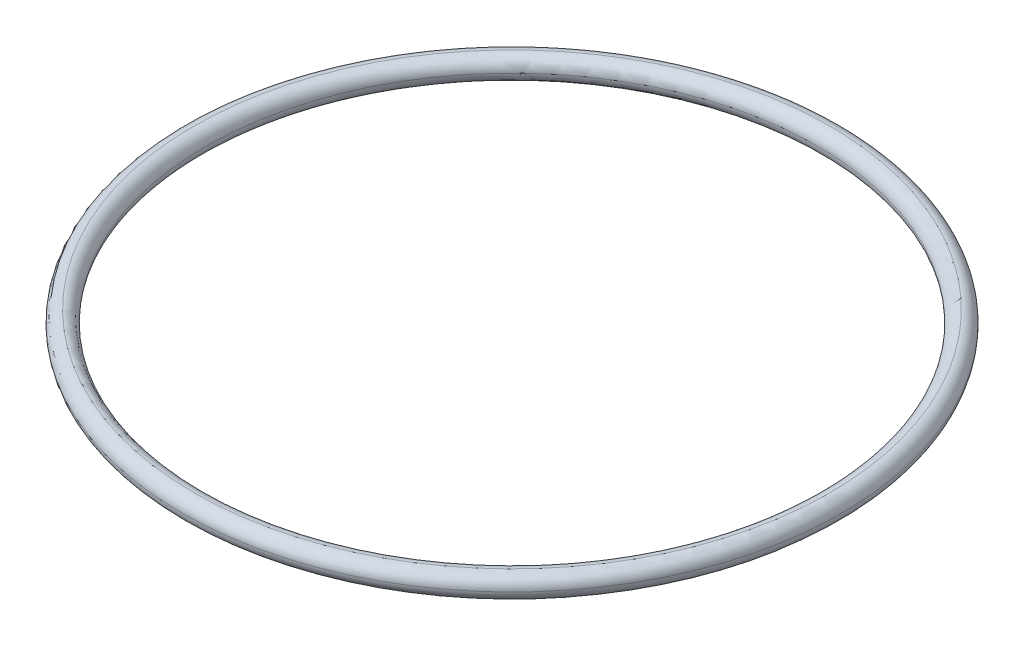
ISO-10303-21;
HEADER;
FILE_DESCRIPTION(('STEP AP214'),'2;1');
FILE_NAME('part.step','',(''),(''),'','','');
FILE_SCHEMA(('AUTOMOTIVE_DESIGN { 1 0 10303 214 1 1 1 1 }'));
ENDSEC;
DATA;
#1=APPLICATION_CONTEXT('core data for automotive mechanical design processes');
#2=APPLICATION_PROTOCOL_DEFINITION('international standard','automotive_design',2000,#1);
#3=PRODUCT_CONTEXT('',#1,'mechanical');
#4=PRODUCT('Part','Part','',(#3));
#5=PRODUCT_RELATED_PRODUCT_CATEGORY('part','',(#4));
#6=PRODUCT_DEFINITION_FORMATION('','',#4);
#7=PRODUCT_DEFINITION_CONTEXT('part definition',#1,'design');
#8=PRODUCT_DEFINITION('design','',#6,#7);
#9=PRODUCT_DEFINITION_SHAPE('','',#8);
#10=(LENGTH_UNIT() NAMED_UNIT(*) SI_UNIT(.MILLI.,.METRE.));
#11=(NAMED_UNIT(*) PLANE_ANGLE_UNIT() SI_UNIT($,.RADIAN.));
#12=(NAMED_UNIT(*) SI_UNIT($,.STERADIAN.) SOLID_ANGLE_UNIT());
#13=UNCERTAINTY_MEASURE_WITH_UNIT(LENGTH_MEASURE(1.E-05),#10,'distance_accuracy_value','');
#14=(GEOMETRIC_REPRESENTATION_CONTEXT(3) GLOBAL_UNCERTAINTY_ASSIGNED_CONTEXT((#13)) GLOBAL_UNIT_ASSIGNED_CONTEXT((#10,
#11,#12)) REPRESENTATION_CONTEXT('',''));
#15=CARTESIAN_POINT('',(0.,0.,0.));
#16=DIRECTION('',(0.,0.,1.));
#17=DIRECTION('',(1.,0.,0.));
#18=AXIS2_PLACEMENT_3D('',#15,#16,#17);
#19=CARTESIAN_POINT('',(0.,1.25,0.));
#20=DIRECTION('',(0.,1.,0.));
#21=DIRECTION('',(0.,0.,1.));
#22=AXIS2_PLACEMENT_3D('',#19,#20,#21);
#23=TOROIDAL_SURFACE('',#22,33.75,1.25);
#24=CARTESIAN_POINT('',(0.,1.25,0.));
#25=DIRECTION('',(0.,1.,0.));
#26=DIRECTION('',(0.,0.,1.));
#27=AXIS2_PLACEMENT_3D('',#24,#25,#26);
#28=CIRCLE('',#27,35.);
#29=CARTESIAN_POINT('',(0.,1.25,35.));
#30=VERTEX_POINT('',#29);
#31=EDGE_CURVE('E44',#30,#30,#28,.F.);
#32=ORIENTED_EDGE('',*,*,#31,.F.);
#33=EDGE_LOOP('',(#32));
#34=FACE_BOUND('',#33,.T.);
#35=CARTESIAN_POINT('',(0.,2.5,0.));
#36=DIRECTION('',(0.,1.,0.));
#37=DIRECTION('',(0.,0.,1.));
#38=AXIS2_PLACEMENT_3D('',#35,#36,#37);
#39=CIRCLE('',#38,33.75);
#40=CARTESIAN_POINT('',(0.,2.5,33.75));
#41=VERTEX_POINT('',#40);
#42=EDGE_CURVE('E10',#41,#41,#39,.T.);
#43=ORIENTED_EDGE('',*,*,#42,.F.);
#44=EDGE_LOOP('',(#43));
#45=FACE_BOUND('',#44,.T.);
#46=ADVANCED_FACE('F37',(#34,#45),#23,.T.);
#47=CARTESIAN_POINT('',(0.,1.25,0.));
#48=DIRECTION('',(0.,1.,0.));
#49=DIRECTION('',(0.,0.,1.));
#50=AXIS2_PLACEMENT_3D('',#47,#48,#49);
#51=TOROIDAL_SURFACE('',#50,33.75,1.25);
#52=ORIENTED_EDGE('',*,*,#42,.T.);
#53=EDGE_LOOP('',(#52));
#54=FACE_BOUND('',#53,.T.);
#55=CARTESIAN_POINT('',(0.,1.25,0.));
#56=DIRECTION('',(0.,1.,0.));
#57=DIRECTION('',(0.,0.,1.));
#58=AXIS2_PLACEMENT_3D('',#55,#56,#57);
#59=CIRCLE('',#58,32.5);
#60=CARTESIAN_POINT('',(0.,1.25,32.5));
#61=VERTEX_POINT('',#60);
#62=EDGE_CURVE('E49',#61,#61,#59,.T.);
#63=ORIENTED_EDGE('',*,*,#62,.F.);
#64=EDGE_LOOP('',(#63));
#65=FACE_BOUND('',#64,.T.);
#66=ADVANCED_FACE('F65',(#54,#65),#51,.T.);
#67=CARTESIAN_POINT('',(0.,1.25,0.));
#68=DIRECTION('',(0.,1.,0.));
#69=DIRECTION('',(0.,0.,1.));
#70=AXIS2_PLACEMENT_3D('',#67,#68,#69);
#71=TOROIDAL_SURFACE('',#70,33.75,1.25);
#72=ORIENTED_EDGE('',*,*,#31,.T.);
#73=EDGE_LOOP('',(#72));
#74=FACE_BOUND('',#73,.T.);
#75=CARTESIAN_POINT('',(0.,0.,0.));
#76=DIRECTION('',(0.,1.,0.));
#77=DIRECTION('',(0.,0.,1.));
#78=AXIS2_PLACEMENT_3D('',#75,#76,#77);
#79=CIRCLE('',#78,33.75);
#80=CARTESIAN_POINT('',(0.,0.,33.75));
#81=VERTEX_POINT('',#80);
#82=EDGE_CURVE('E54',#81,#81,#79,.F.);
#83=ORIENTED_EDGE('',*,*,#82,.F.);
#84=EDGE_LOOP('',(#83));
#85=FACE_BOUND('',#84,.T.);
#86=ADVANCED_FACE('F63',(#74,#85),#71,.T.);
#87=CARTESIAN_POINT('',(0.,1.25,0.));
#88=DIRECTION('',(0.,1.,0.));
#89=DIRECTION('',(0.,0.,1.));
#90=AXIS2_PLACEMENT_3D('',#87,#88,#89);
#91=TOROIDAL_SURFACE('',#90,33.75,1.25);
#92=ORIENTED_EDGE('',*,*,#62,.T.);
#93=EDGE_LOOP('',(#92));
#94=FACE_BOUND('',#93,.T.);
#95=ORIENTED_EDGE('',*,*,#82,.T.);
#96=EDGE_LOOP('',(#95));
#97=FACE_BOUND('',#96,.T.);
#98=ADVANCED_FACE('F61',(#94,#97),#91,.T.);
#99=CLOSED_SHELL('',(#46,#66,#86,#98));
#100=MANIFOLD_SOLID_BREP('B2',#99);
#101=ADVANCED_BREP_SHAPE_REPRESENTATION('',(#18,#100),#14);
#102=SHAPE_DEFINITION_REPRESENTATION(#9,#101);
ENDSEC;
END-ISO-10303-21;
